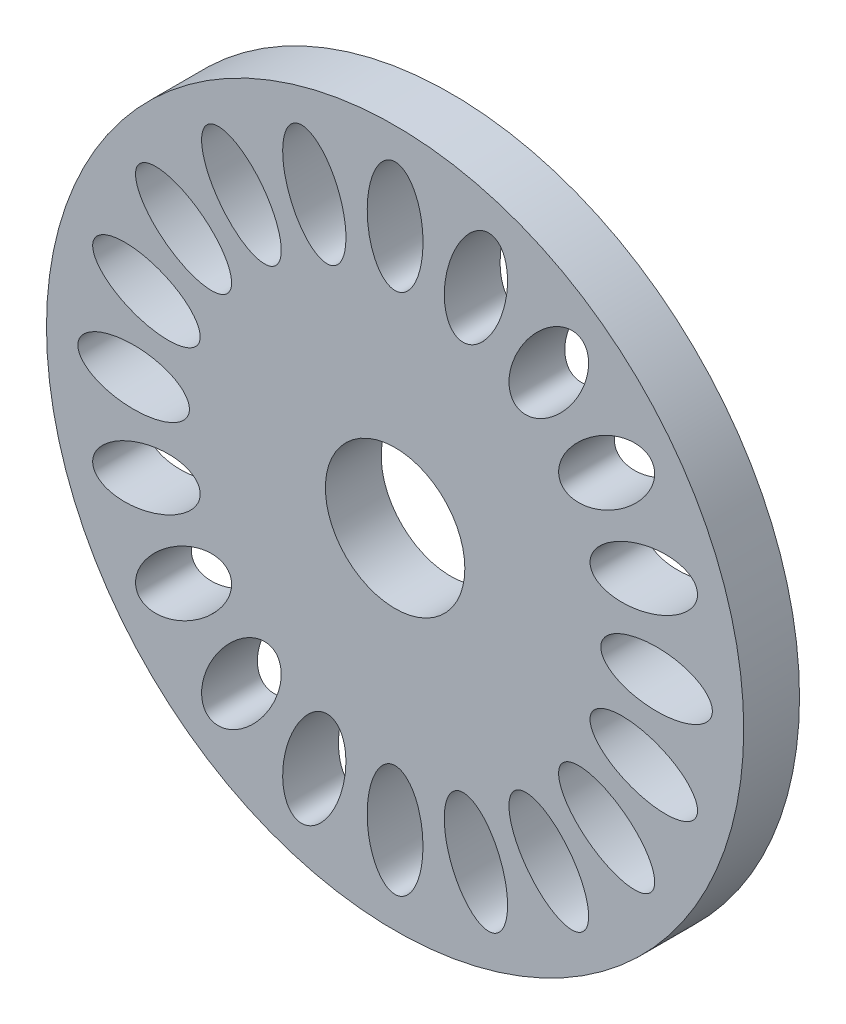
ISO-10303-21;
HEADER;
FILE_DESCRIPTION(('STEP AP214'),'2;1');
FILE_NAME('part.step','',(''),(''),'','','');
FILE_SCHEMA(('AUTOMOTIVE_DESIGN { 1 0 10303 214 1 1 1 1 }'));
ENDSEC;
DATA;
#1=APPLICATION_CONTEXT('core data for automotive mechanical design processes');
#2=APPLICATION_PROTOCOL_DEFINITION('international standard','automotive_design',2000,#1);
#3=PRODUCT_CONTEXT('',#1,'mechanical');
#4=PRODUCT('Part','Part','',(#3));
#5=PRODUCT_RELATED_PRODUCT_CATEGORY('part','',(#4));
#6=PRODUCT_DEFINITION_FORMATION('','',#4);
#7=PRODUCT_DEFINITION_CONTEXT('part definition',#1,'design');
#8=PRODUCT_DEFINITION('design','',#6,#7);
#9=PRODUCT_DEFINITION_SHAPE('','',#8);
#10=(LENGTH_UNIT() NAMED_UNIT(*) SI_UNIT(.MILLI.,.METRE.));
#11=(NAMED_UNIT(*) PLANE_ANGLE_UNIT() SI_UNIT($,.RADIAN.));
#12=(NAMED_UNIT(*) SI_UNIT($,.STERADIAN.) SOLID_ANGLE_UNIT());
#13=UNCERTAINTY_MEASURE_WITH_UNIT(LENGTH_MEASURE(1.E-05),#10,'distance_accuracy_value','');
#14=(GEOMETRIC_REPRESENTATION_CONTEXT(3) GLOBAL_UNCERTAINTY_ASSIGNED_CONTEXT((#13)) GLOBAL_UNIT_ASSIGNED_CONTEXT((#10,
#11,#12)) REPRESENTATION_CONTEXT('',''));
#15=CARTESIAN_POINT('',(0.,0.,0.));
#16=DIRECTION('',(0.,0.,1.));
#17=DIRECTION('',(1.,0.,0.));
#18=AXIS2_PLACEMENT_3D('',#15,#16,#17);
#19=CARTESIAN_POINT('',(0.,0.,2.));
#20=DIRECTION('',(0.,0.,1.));
#21=DIRECTION('',(1.,0.,0.));
#22=AXIS2_PLACEMENT_3D('',#19,#20,#21);
#23=PLANE('',#22);
#24=CARTESIAN_POINT('',(-5.51048674024184,7.58453432226521,2.));
#25=DIRECTION('',(0.,0.,1.));
#26=DIRECTION('',(0.587785252292463,-0.809016994374955,0.));
#27=AXIS2_PLACEMENT_3D('',#24,#25,#26);
#28=ELLIPSE('',#27,2.,1.);
#29=CARTESIAN_POINT('',(-4.33491623565691,5.9665003335153,2.));
#30=VERTEX_POINT('',#29);
#31=EDGE_CURVE('E181',#30,#30,#28,.T.);
#32=ORIENTED_EDGE('',*,*,#31,.F.);
#33=EDGE_LOOP('',(#32));
#34=FACE_BOUND('',#33,.T.);
#35=CARTESIAN_POINT('',(-8.91615484026703,2.89703432226523,2.));
#36=DIRECTION('',(0.,0.,1.));
#37=DIRECTION('',(0.95105651629515,-0.309016994374958,0.));
#38=AXIS2_PLACEMENT_3D('',#35,#36,#37);
#39=ELLIPSE('',#38,2.,1.);
#40=CARTESIAN_POINT('',(-7.01404180767673,2.27900033351532,2.));
#41=VERTEX_POINT('',#40);
#42=EDGE_CURVE('E207',#41,#41,#39,.T.);
#43=ORIENTED_EDGE('',*,*,#42,.F.);
#44=EDGE_LOOP('',(#43));
#45=FACE_BOUND('',#44,.T.);
#46=CARTESIAN_POINT('',(-8.91615484026709,-2.89703432226505,2.));
#47=DIRECTION('',(0.,0.,1.));
#48=DIRECTION('',(0.951056516295156,0.309016994374939,0.));
#49=AXIS2_PLACEMENT_3D('',#46,#47,#48);
#50=ELLIPSE('',#49,2.,1.);
#51=CARTESIAN_POINT('',(-7.01404180767678,-2.27900033351517,2.));
#52=VERTEX_POINT('',#51);
#53=EDGE_CURVE('E231',#52,#52,#50,.T.);
#54=ORIENTED_EDGE('',*,*,#53,.F.);
#55=EDGE_LOOP('',(#54));
#56=FACE_BOUND('',#55,.T.);
#57=CARTESIAN_POINT('',(-5.510486740242,-7.58453432226508,2.));
#58=DIRECTION('',(0.,0.,1.));
#59=DIRECTION('',(0.58778525229248,0.809016994374943,0.));
#60=AXIS2_PLACEMENT_3D('',#57,#58,#59);
#61=ELLIPSE('',#60,2.,1.);
#62=CARTESIAN_POINT('',(-4.33491623565704,-5.9665003335152,2.));
#63=VERTEX_POINT('',#62);
#64=EDGE_CURVE('E244',#63,#63,#61,.T.);
#65=ORIENTED_EDGE('',*,*,#64,.F.);
#66=EDGE_LOOP('',(#65));
#67=FACE_BOUND('',#66,.T.);
#68=CARTESIAN_POINT('',(0.,-9.375,2.));
#69=DIRECTION('',(0.,0.,1.));
#70=DIRECTION('',(0.,1.,0.));
#71=AXIS2_PLACEMENT_3D('',#68,#69,#70);
#72=ELLIPSE('',#71,2.,1.);
#73=CARTESIAN_POINT('',(0.,-7.375,2.));
#74=VERTEX_POINT('',#73);
#75=EDGE_CURVE('E267',#74,#74,#72,.T.);
#76=ORIENTED_EDGE('',*,*,#75,.F.);
#77=EDGE_LOOP('',(#76));
#78=FACE_BOUND('',#77,.T.);
#79=CARTESIAN_POINT('',(5.51048674024189,-7.58453432226516,2.));
#80=DIRECTION('',(0.,0.,1.));
#81=DIRECTION('',(-0.587785252292469,0.809016994374951,0.));
#82=AXIS2_PLACEMENT_3D('',#79,#80,#81);
#83=ELLIPSE('',#82,2.,1.);
#84=CARTESIAN_POINT('',(4.33491623565696,-5.96650033351526,2.));
#85=VERTEX_POINT('',#84);
#86=EDGE_CURVE('E291',#85,#85,#83,.T.);
#87=ORIENTED_EDGE('',*,*,#86,.F.);
#88=EDGE_LOOP('',(#87));
#89=FACE_BOUND('',#88,.T.);
#90=CARTESIAN_POINT('',(8.91615484026705,-2.89703432226517,2.));
#91=DIRECTION('',(0.,0.,1.));
#92=DIRECTION('',(-0.951056516295153,0.309016994374951,0.));
#93=AXIS2_PLACEMENT_3D('',#90,#91,#92);
#94=ELLIPSE('',#93,2.,1.);
#95=CARTESIAN_POINT('',(7.01404180767675,-2.27900033351527,2.));
#96=VERTEX_POINT('',#95);
#97=EDGE_CURVE('E304',#96,#96,#94,.T.);
#98=ORIENTED_EDGE('',*,*,#97,.F.);
#99=EDGE_LOOP('',(#98));
#100=FACE_BOUND('',#99,.T.);
#101=CARTESIAN_POINT('',(8.91615484026708,2.89703432226511,2.));
#102=DIRECTION('',(0.,0.,1.));
#103=DIRECTION('',(-0.951056516295154,-0.309016994374945,0.));
#104=AXIS2_PLACEMENT_3D('',#101,#102,#103);
#105=ELLIPSE('',#104,2.,1.);
#106=CARTESIAN_POINT('',(7.01404180767677,2.27900033351522,2.));
#107=VERTEX_POINT('',#106);
#108=EDGE_CURVE('E327',#107,#107,#105,.T.);
#109=ORIENTED_EDGE('',*,*,#108,.F.);
#110=EDGE_LOOP('',(#109));
#111=FACE_BOUND('',#110,.T.);
#112=CARTESIAN_POINT('',(5.51048674024195,7.58453432226513,2.));
#113=DIRECTION('',(0.,0.,1.));
#114=DIRECTION('',(-0.587785252292473,-0.809016994374947,0.));
#115=AXIS2_PLACEMENT_3D('',#112,#113,#114);
#116=ELLIPSE('',#115,2.,1.);
#117=CARTESIAN_POINT('',(4.334916235657,5.96650033351523,2.));
#118=VERTEX_POINT('',#117);
#119=EDGE_CURVE('E346',#118,#118,#116,.T.);
#120=ORIENTED_EDGE('',*,*,#119,.F.);
#121=EDGE_LOOP('',(#120));
#122=FACE_BOUND('',#121,.T.);
#123=CARTESIAN_POINT('',(0.,9.375,2.));
#124=DIRECTION('',(0.,0.,1.));
#125=DIRECTION('',(0.,-1.,0.));
#126=AXIS2_PLACEMENT_3D('',#123,#124,#125);
#127=ELLIPSE('',#126,2.,1.);
#128=CARTESIAN_POINT('',(0.,7.375,2.));
#129=VERTEX_POINT('',#128);
#130=EDGE_CURVE('E56',#129,#129,#127,.T.);
#131=ORIENTED_EDGE('',*,*,#130,.F.);
#132=EDGE_LOOP('',(#131));
#133=FACE_BOUND('',#132,.T.);
#134=CARTESIAN_POINT('',(0.,0.,2.));
#135=DIRECTION('',(0.,0.,1.));
#136=DIRECTION('',(1.,0.,0.));
#137=AXIS2_PLACEMENT_3D('',#134,#135,#136);
#138=CIRCLE('',#137,12.5);
#139=CARTESIAN_POINT('',(12.5,0.,2.));
#140=VERTEX_POINT('',#139);
#141=EDGE_CURVE('E10',#140,#140,#138,.T.);
#142=ORIENTED_EDGE('',*,*,#141,.T.);
#143=EDGE_LOOP('',(#142));
#144=FACE_BOUND('',#143,.T.);
#145=CARTESIAN_POINT('',(0.,0.,2.));
#146=DIRECTION('',(0.,0.,1.));
#147=DIRECTION('',(1.,0.,0.));
#148=AXIS2_PLACEMENT_3D('',#145,#146,#147);
#149=CIRCLE('',#148,2.5);
#150=CARTESIAN_POINT('',(2.5,0.,2.));
#151=VERTEX_POINT('',#150);
#152=EDGE_CURVE('E50',#151,#151,#149,.T.);
#153=ORIENTED_EDGE('',*,*,#152,.F.);
#154=EDGE_LOOP('',(#153));
#155=FACE_BOUND('',#154,.T.);
#156=CARTESIAN_POINT('',(2.89703432226514,8.91615484026707,2.));
#157=DIRECTION('',(0.,0.,1.));
#158=DIRECTION('',(-0.309016994374948,-0.951056516295153,0.));
#159=AXIS2_PLACEMENT_3D('',#156,#157,#158);
#160=ELLIPSE('',#159,2.,1.);
#161=CARTESIAN_POINT('',(2.27900033351524,7.01404180767676,2.));
#162=VERTEX_POINT('',#161);
#163=EDGE_CURVE('E64',#162,#162,#160,.T.);
#164=ORIENTED_EDGE('',*,*,#163,.F.);
#165=EDGE_LOOP('',(#164));
#166=FACE_BOUND('',#165,.T.);
#167=CARTESIAN_POINT('',(7.58453432226514,5.51048674024192,2.));
#168=DIRECTION('',(0.,0.,1.));
#169=DIRECTION('',(-0.809016994374948,-0.587785252292472,0.));
#170=AXIS2_PLACEMENT_3D('',#167,#168,#169);
#171=ELLIPSE('',#170,2.,1.);
#172=CARTESIAN_POINT('',(5.96650033351525,4.33491623565698,2.));
#173=VERTEX_POINT('',#172);
#174=EDGE_CURVE('E334',#173,#173,#171,.T.);
#175=ORIENTED_EDGE('',*,*,#174,.F.);
#176=EDGE_LOOP('',(#175));
#177=FACE_BOUND('',#176,.T.);
#178=CARTESIAN_POINT('',(9.375,0.,2.));
#179=DIRECTION('',(0.,0.,1.));
#180=DIRECTION('',(-1.,0.,0.));
#181=AXIS2_PLACEMENT_3D('',#178,#179,#180);
#182=ELLIPSE('',#181,2.,1.);
#183=CARTESIAN_POINT('',(7.375,0.,2.));
#184=VERTEX_POINT('',#183);
#185=EDGE_CURVE('E321',#184,#184,#182,.T.);
#186=ORIENTED_EDGE('',*,*,#185,.F.);
#187=EDGE_LOOP('',(#186));
#188=FACE_BOUND('',#187,.T.);
#189=CARTESIAN_POINT('',(7.58453432226511,-5.51048674024197,2.));
#190=DIRECTION('',(0.,0.,1.));
#191=DIRECTION('',(-0.809016994374945,0.587785252292476,0.));
#192=AXIS2_PLACEMENT_3D('',#189,#190,#191);
#193=ELLIPSE('',#192,2.,1.);
#194=CARTESIAN_POINT('',(5.96650033351522,-4.33491623565702,2.));
#195=VERTEX_POINT('',#194);
#196=EDGE_CURVE('E297',#195,#195,#193,.T.);
#197=ORIENTED_EDGE('',*,*,#196,.F.);
#198=EDGE_LOOP('',(#197));
#199=FACE_BOUND('',#198,.T.);
#200=CARTESIAN_POINT('',(2.89703432226508,-8.91615484026709,2.));
#201=DIRECTION('',(0.,0.,1.));
#202=DIRECTION('',(-0.309016994374941,0.951056516295156,0.));
#203=AXIS2_PLACEMENT_3D('',#200,#201,#202);
#204=ELLIPSE('',#203,2.,1.);
#205=CARTESIAN_POINT('',(2.27900033351519,-7.01404180767677,2.));
#206=VERTEX_POINT('',#205);
#207=EDGE_CURVE('E274',#206,#206,#204,.T.);
#208=ORIENTED_EDGE('',*,*,#207,.F.);
#209=EDGE_LOOP('',(#208));
#210=FACE_BOUND('',#209,.T.);
#211=CARTESIAN_POINT('',(-2.8970343222652,-8.91615484026704,2.));
#212=DIRECTION('',(0.,0.,1.));
#213=DIRECTION('',(0.309016994374954,0.951056516295151,0.));
#214=AXIS2_PLACEMENT_3D('',#211,#212,#213);
#215=ELLIPSE('',#214,2.,1.);
#216=CARTESIAN_POINT('',(-2.27900033351529,-7.01404180767674,2.));
#217=VERTEX_POINT('',#216);
#218=EDGE_CURVE('E261',#217,#217,#215,.T.);
#219=ORIENTED_EDGE('',*,*,#218,.F.);
#220=EDGE_LOOP('',(#219));
#221=FACE_BOUND('',#220,.T.);
#222=CARTESIAN_POINT('',(-7.58453432226519,-5.51048674024186,2.));
#223=DIRECTION('',(0.,0.,1.));
#224=DIRECTION('',(0.809016994374953,0.587785252292466,0.));
#225=AXIS2_PLACEMENT_3D('',#222,#223,#224);
#226=ELLIPSE('',#225,2.,1.);
#227=CARTESIAN_POINT('',(-5.96650033351528,-4.33491623565693,2.));
#228=VERTEX_POINT('',#227);
#229=EDGE_CURVE('E237',#228,#228,#226,.T.);
#230=ORIENTED_EDGE('',*,*,#229,.F.);
#231=EDGE_LOOP('',(#230));
#232=FACE_BOUND('',#231,.T.);
#233=CARTESIAN_POINT('',(-9.375,0.,2.));
#234=DIRECTION('',(0.,0.,1.));
#235=DIRECTION('',(1.,0.,0.));
#236=AXIS2_PLACEMENT_3D('',#233,#234,#235);
#237=ELLIPSE('',#236,2.,1.);
#238=CARTESIAN_POINT('',(-7.375,0.,2.));
#239=VERTEX_POINT('',#238);
#240=EDGE_CURVE('E214',#239,#239,#237,.T.);
#241=ORIENTED_EDGE('',*,*,#240,.F.);
#242=EDGE_LOOP('',(#241));
#243=FACE_BOUND('',#242,.T.);
#244=CARTESIAN_POINT('',(-7.58453432226507,5.51048674024203,2.));
#245=DIRECTION('',(0.,0.,1.));
#246=DIRECTION('',(0.809016994374941,-0.587785252292483,0.));
#247=AXIS2_PLACEMENT_3D('',#244,#245,#246);
#248=ELLIPSE('',#247,2.,1.);
#249=CARTESIAN_POINT('',(-5.96650033351518,4.33491623565706,2.));
#250=VERTEX_POINT('',#249);
#251=EDGE_CURVE('E201',#250,#250,#248,.T.);
#252=ORIENTED_EDGE('',*,*,#251,.F.);
#253=EDGE_LOOP('',(#252));
#254=FACE_BOUND('',#253,.T.);
#255=CARTESIAN_POINT('',(-2.89703432226502,8.9161548402671,2.));
#256=DIRECTION('',(0.,0.,1.));
#257=DIRECTION('',(0.309016994374935,-0.951056516295158,0.));
#258=AXIS2_PLACEMENT_3D('',#255,#256,#257);
#259=ELLIPSE('',#258,2.,1.);
#260=CARTESIAN_POINT('',(-2.27900033351514,7.01404180767679,2.));
#261=VERTEX_POINT('',#260);
#262=EDGE_CURVE('E174',#261,#261,#259,.T.);
#263=ORIENTED_EDGE('',*,*,#262,.F.);
#264=EDGE_LOOP('',(#263));
#265=FACE_BOUND('',#264,.T.);
#266=ADVANCED_FACE('F37',(#34,#45,#56,#67,#78,#89,#100,#111,#122,#133,#144,#155,#166,#177,#188,
#199,#210,#221,#232,#243,#254,#265),#23,.T.);
#267=CARTESIAN_POINT('',(0.,0.,0.));
#268=DIRECTION('',(0.,0.,1.));
#269=DIRECTION('',(1.,0.,0.));
#270=AXIS2_PLACEMENT_3D('',#267,#268,#269);
#271=PLANE('',#270);
#272=CARTESIAN_POINT('',(0.,0.,0.));
#273=DIRECTION('',(0.,0.,1.));
#274=DIRECTION('',(1.,0.,0.));
#275=AXIS2_PLACEMENT_3D('',#272,#273,#274);
#276=CIRCLE('',#275,12.5);
#277=CARTESIAN_POINT('',(12.5,0.,0.));
#278=VERTEX_POINT('',#277);
#279=EDGE_CURVE('E41',#278,#278,#276,.T.);
#280=ORIENTED_EDGE('',*,*,#279,.F.);
#281=EDGE_LOOP('',(#280));
#282=FACE_BOUND('',#281,.T.);
#283=CARTESIAN_POINT('',(0.,0.,0.));
#284=DIRECTION('',(0.,0.,1.));
#285=DIRECTION('',(1.,0.,0.));
#286=AXIS2_PLACEMENT_3D('',#283,#284,#285);
#287=CIRCLE('',#286,2.5);
#288=CARTESIAN_POINT('',(2.5,0.,0.));
#289=VERTEX_POINT('',#288);
#290=EDGE_CURVE('E52',#289,#289,#287,.T.);
#291=ORIENTED_EDGE('',*,*,#290,.T.);
#292=EDGE_LOOP('',(#291));
#293=FACE_BOUND('',#292,.T.);
#294=CARTESIAN_POINT('',(0.,9.375,0.));
#295=DIRECTION('',(0.,0.,1.));
#296=DIRECTION('',(0.,-1.,0.));
#297=AXIS2_PLACEMENT_3D('',#294,#295,#296);
#298=ELLIPSE('',#297,2.,1.);
#299=CARTESIAN_POINT('',(0.,7.375,0.));
#300=VERTEX_POINT('',#299);
#301=EDGE_CURVE('E60',#300,#300,#298,.T.);
#302=ORIENTED_EDGE('',*,*,#301,.T.);
#303=EDGE_LOOP('',(#302));
#304=FACE_BOUND('',#303,.T.);
#305=CARTESIAN_POINT('',(2.89703432226514,8.91615484026707,0.));
#306=DIRECTION('',(0.,0.,1.));
#307=DIRECTION('',(-0.309016994374948,-0.951056516295153,0.));
#308=AXIS2_PLACEMENT_3D('',#305,#306,#307);
#309=ELLIPSE('',#308,2.,1.);
#310=CARTESIAN_POINT('',(2.27900033351524,7.01404180767676,0.));
#311=VERTEX_POINT('',#310);
#312=EDGE_CURVE('E69',#311,#311,#309,.T.);
#313=ORIENTED_EDGE('',*,*,#312,.T.);
#314=EDGE_LOOP('',(#313));
#315=FACE_BOUND('',#314,.T.);
#316=CARTESIAN_POINT('',(5.51048674024195,7.58453432226513,0.));
#317=DIRECTION('',(0.,0.,1.));
#318=DIRECTION('',(-0.587785252292473,-0.809016994374947,0.));
#319=AXIS2_PLACEMENT_3D('',#316,#317,#318);
#320=ELLIPSE('',#319,2.,1.);
#321=CARTESIAN_POINT('',(4.334916235657,5.96650033351523,0.));
#322=VERTEX_POINT('',#321);
#323=EDGE_CURVE('E104',#322,#322,#320,.T.);
#324=ORIENTED_EDGE('',*,*,#323,.T.);
#325=EDGE_LOOP('',(#324));
#326=FACE_BOUND('',#325,.T.);
#327=CARTESIAN_POINT('',(7.58453432226514,5.51048674024192,0.));
#328=DIRECTION('',(0.,0.,1.));
#329=DIRECTION('',(-0.809016994374948,-0.587785252292472,0.));
#330=AXIS2_PLACEMENT_3D('',#327,#328,#329);
#331=ELLIPSE('',#330,2.,1.);
#332=CARTESIAN_POINT('',(5.96650033351525,4.33491623565698,0.));
#333=VERTEX_POINT('',#332);
#334=EDGE_CURVE('E108',#333,#333,#331,.T.);
#335=ORIENTED_EDGE('',*,*,#334,.T.);
#336=EDGE_LOOP('',(#335));
#337=FACE_BOUND('',#336,.T.);
#338=CARTESIAN_POINT('',(8.91615484026708,2.89703432226511,0.));
#339=DIRECTION('',(0.,0.,1.));
#340=DIRECTION('',(-0.951056516295154,-0.309016994374945,0.));
#341=AXIS2_PLACEMENT_3D('',#338,#339,#340);
#342=ELLIPSE('',#341,2.,1.);
#343=CARTESIAN_POINT('',(7.01404180767677,2.27900033351522,0.));
#344=VERTEX_POINT('',#343);
#345=EDGE_CURVE('E112',#344,#344,#342,.T.);
#346=ORIENTED_EDGE('',*,*,#345,.T.);
#347=EDGE_LOOP('',(#346));
#348=FACE_BOUND('',#347,.T.);
#349=CARTESIAN_POINT('',(9.375,0.,0.));
#350=DIRECTION('',(0.,0.,1.));
#351=DIRECTION('',(-1.,0.,0.));
#352=AXIS2_PLACEMENT_3D('',#349,#350,#351);
#353=ELLIPSE('',#352,2.,1.);
#354=CARTESIAN_POINT('',(7.375,0.,0.));
#355=VERTEX_POINT('',#354);
#356=EDGE_CURVE('E116',#355,#355,#353,.T.);
#357=ORIENTED_EDGE('',*,*,#356,.T.);
#358=EDGE_LOOP('',(#357));
#359=FACE_BOUND('',#358,.T.);
#360=CARTESIAN_POINT('',(8.91615484026705,-2.89703432226517,0.));
#361=DIRECTION('',(0.,0.,1.));
#362=DIRECTION('',(-0.951056516295153,0.309016994374951,0.));
#363=AXIS2_PLACEMENT_3D('',#360,#361,#362);
#364=ELLIPSE('',#363,2.,1.);
#365=CARTESIAN_POINT('',(7.01404180767675,-2.27900033351527,0.));
#366=VERTEX_POINT('',#365);
#367=EDGE_CURVE('E120',#366,#366,#364,.T.);
#368=ORIENTED_EDGE('',*,*,#367,.T.);
#369=EDGE_LOOP('',(#368));
#370=FACE_BOUND('',#369,.T.);
#371=CARTESIAN_POINT('',(7.58453432226511,-5.51048674024197,0.));
#372=DIRECTION('',(0.,0.,1.));
#373=DIRECTION('',(-0.809016994374945,0.587785252292476,0.));
#374=AXIS2_PLACEMENT_3D('',#371,#372,#373);
#375=ELLIPSE('',#374,2.,1.);
#376=CARTESIAN_POINT('',(5.96650033351522,-4.33491623565702,0.));
#377=VERTEX_POINT('',#376);
#378=EDGE_CURVE('E124',#377,#377,#375,.T.);
#379=ORIENTED_EDGE('',*,*,#378,.T.);
#380=EDGE_LOOP('',(#379));
#381=FACE_BOUND('',#380,.T.);
#382=CARTESIAN_POINT('',(5.51048674024189,-7.58453432226516,0.));
#383=DIRECTION('',(0.,0.,1.));
#384=DIRECTION('',(-0.587785252292469,0.809016994374951,0.));
#385=AXIS2_PLACEMENT_3D('',#382,#383,#384);
#386=ELLIPSE('',#385,2.,1.);
#387=CARTESIAN_POINT('',(4.33491623565696,-5.96650033351526,0.));
#388=VERTEX_POINT('',#387);
#389=EDGE_CURVE('E128',#388,#388,#386,.T.);
#390=ORIENTED_EDGE('',*,*,#389,.T.);
#391=EDGE_LOOP('',(#390));
#392=FACE_BOUND('',#391,.T.);
#393=CARTESIAN_POINT('',(2.89703432226508,-8.91615484026709,0.));
#394=DIRECTION('',(0.,0.,1.));
#395=DIRECTION('',(-0.309016994374941,0.951056516295156,0.));
#396=AXIS2_PLACEMENT_3D('',#393,#394,#395);
#397=ELLIPSE('',#396,2.,1.);
#398=CARTESIAN_POINT('',(2.27900033351519,-7.01404180767677,0.));
#399=VERTEX_POINT('',#398);
#400=EDGE_CURVE('E132',#399,#399,#397,.T.);
#401=ORIENTED_EDGE('',*,*,#400,.T.);
#402=EDGE_LOOP('',(#401));
#403=FACE_BOUND('',#402,.T.);
#404=CARTESIAN_POINT('',(0.,-9.375,0.));
#405=DIRECTION('',(0.,0.,1.));
#406=DIRECTION('',(0.,1.,0.));
#407=AXIS2_PLACEMENT_3D('',#404,#405,#406);
#408=ELLIPSE('',#407,2.,1.);
#409=CARTESIAN_POINT('',(0.,-7.375,0.));
#410=VERTEX_POINT('',#409);
#411=EDGE_CURVE('E136',#410,#410,#408,.T.);
#412=ORIENTED_EDGE('',*,*,#411,.T.);
#413=EDGE_LOOP('',(#412));
#414=FACE_BOUND('',#413,.T.);
#415=CARTESIAN_POINT('',(-2.8970343222652,-8.91615484026704,0.));
#416=DIRECTION('',(0.,0.,1.));
#417=DIRECTION('',(0.309016994374954,0.951056516295151,0.));
#418=AXIS2_PLACEMENT_3D('',#415,#416,#417);
#419=ELLIPSE('',#418,2.,1.);
#420=CARTESIAN_POINT('',(-2.27900033351529,-7.01404180767674,0.));
#421=VERTEX_POINT('',#420);
#422=EDGE_CURVE('E140',#421,#421,#419,.T.);
#423=ORIENTED_EDGE('',*,*,#422,.T.);
#424=EDGE_LOOP('',(#423));
#425=FACE_BOUND('',#424,.T.);
#426=CARTESIAN_POINT('',(-5.510486740242,-7.58453432226508,0.));
#427=DIRECTION('',(0.,0.,1.));
#428=DIRECTION('',(0.58778525229248,0.809016994374943,0.));
#429=AXIS2_PLACEMENT_3D('',#426,#427,#428);
#430=ELLIPSE('',#429,2.,1.);
#431=CARTESIAN_POINT('',(-4.33491623565704,-5.9665003335152,0.));
#432=VERTEX_POINT('',#431);
#433=EDGE_CURVE('E144',#432,#432,#430,.T.);
#434=ORIENTED_EDGE('',*,*,#433,.T.);
#435=EDGE_LOOP('',(#434));
#436=FACE_BOUND('',#435,.T.);
#437=CARTESIAN_POINT('',(-7.58453432226519,-5.51048674024186,0.));
#438=DIRECTION('',(0.,0.,1.));
#439=DIRECTION('',(0.809016994374953,0.587785252292466,0.));
#440=AXIS2_PLACEMENT_3D('',#437,#438,#439);
#441=ELLIPSE('',#440,2.,1.);
#442=CARTESIAN_POINT('',(-5.96650033351528,-4.33491623565693,0.));
#443=VERTEX_POINT('',#442);
#444=EDGE_CURVE('E148',#443,#443,#441,.T.);
#445=ORIENTED_EDGE('',*,*,#444,.T.);
#446=EDGE_LOOP('',(#445));
#447=FACE_BOUND('',#446,.T.);
#448=CARTESIAN_POINT('',(-8.91615484026709,-2.89703432226505,0.));
#449=DIRECTION('',(0.,0.,1.));
#450=DIRECTION('',(0.951056516295156,0.309016994374939,0.));
#451=AXIS2_PLACEMENT_3D('',#448,#449,#450);
#452=ELLIPSE('',#451,2.,1.);
#453=CARTESIAN_POINT('',(-7.01404180767678,-2.27900033351517,0.));
#454=VERTEX_POINT('',#453);
#455=EDGE_CURVE('E152',#454,#454,#452,.T.);
#456=ORIENTED_EDGE('',*,*,#455,.T.);
#457=EDGE_LOOP('',(#456));
#458=FACE_BOUND('',#457,.T.);
#459=CARTESIAN_POINT('',(-9.375,0.,0.));
#460=DIRECTION('',(0.,0.,1.));
#461=DIRECTION('',(1.,0.,0.));
#462=AXIS2_PLACEMENT_3D('',#459,#460,#461);
#463=ELLIPSE('',#462,2.,1.);
#464=CARTESIAN_POINT('',(-7.375,0.,0.));
#465=VERTEX_POINT('',#464);
#466=EDGE_CURVE('E156',#465,#465,#463,.T.);
#467=ORIENTED_EDGE('',*,*,#466,.T.);
#468=EDGE_LOOP('',(#467));
#469=FACE_BOUND('',#468,.T.);
#470=CARTESIAN_POINT('',(-8.91615484026703,2.89703432226523,0.));
#471=DIRECTION('',(0.,0.,1.));
#472=DIRECTION('',(0.95105651629515,-0.309016994374958,0.));
#473=AXIS2_PLACEMENT_3D('',#470,#471,#472);
#474=ELLIPSE('',#473,2.,1.);
#475=CARTESIAN_POINT('',(-7.01404180767673,2.27900033351532,0.));
#476=VERTEX_POINT('',#475);
#477=EDGE_CURVE('E160',#476,#476,#474,.T.);
#478=ORIENTED_EDGE('',*,*,#477,.T.);
#479=EDGE_LOOP('',(#478));
#480=FACE_BOUND('',#479,.T.);
#481=CARTESIAN_POINT('',(-7.58453432226507,5.51048674024203,0.));
#482=DIRECTION('',(0.,0.,1.));
#483=DIRECTION('',(0.809016994374941,-0.587785252292483,0.));
#484=AXIS2_PLACEMENT_3D('',#481,#482,#483);
#485=ELLIPSE('',#484,2.,1.);
#486=CARTESIAN_POINT('',(-5.96650033351518,4.33491623565706,0.));
#487=VERTEX_POINT('',#486);
#488=EDGE_CURVE('E164',#487,#487,#485,.T.);
#489=ORIENTED_EDGE('',*,*,#488,.T.);
#490=EDGE_LOOP('',(#489));
#491=FACE_BOUND('',#490,.T.);
#492=CARTESIAN_POINT('',(-5.51048674024184,7.58453432226521,0.));
#493=DIRECTION('',(0.,0.,1.));
#494=DIRECTION('',(0.587785252292463,-0.809016994374955,0.));
#495=AXIS2_PLACEMENT_3D('',#492,#493,#494);
#496=ELLIPSE('',#495,2.,1.);
#497=CARTESIAN_POINT('',(-4.33491623565691,5.9665003335153,0.));
#498=VERTEX_POINT('',#497);
#499=EDGE_CURVE('E168',#498,#498,#496,.T.);
#500=ORIENTED_EDGE('',*,*,#499,.T.);
#501=EDGE_LOOP('',(#500));
#502=FACE_BOUND('',#501,.T.);
#503=CARTESIAN_POINT('',(-2.89703432226502,8.9161548402671,0.));
#504=DIRECTION('',(0.,0.,1.));
#505=DIRECTION('',(0.309016994374935,-0.951056516295158,0.));
#506=AXIS2_PLACEMENT_3D('',#503,#504,#505);
#507=ELLIPSE('',#506,2.,1.);
#508=CARTESIAN_POINT('',(-2.27900033351514,7.01404180767679,0.));
#509=VERTEX_POINT('',#508);
#510=EDGE_CURVE('E171',#509,#509,#507,.T.);
#511=ORIENTED_EDGE('',*,*,#510,.T.);
#512=EDGE_LOOP('',(#511));
#513=FACE_BOUND('',#512,.T.);
#514=ADVANCED_FACE('F84',(#282,#293,#304,#315,#326,#337,#348,#359,#370,#381,#392,#403,#414,#425,
#436,#447,#458,#469,#480,#491,#502,#513),#271,.F.);
#515=CARTESIAN_POINT('',(0.,0.,2.));
#516=DIRECTION('',(0.,0.,-1.));
#517=DIRECTION('',(-1.,0.,0.));
#518=AXIS2_PLACEMENT_3D('',#515,#516,#517);
#519=CYLINDRICAL_SURFACE('',#518,12.5);
#520=ORIENTED_EDGE('',*,*,#141,.F.);
#521=EDGE_LOOP('',(#520));
#522=FACE_BOUND('',#521,.T.);
#523=ORIENTED_EDGE('',*,*,#279,.T.);
#524=EDGE_LOOP('',(#523));
#525=FACE_BOUND('',#524,.T.);
#526=ADVANCED_FACE('F39',(#522,#525),#519,.T.);
#527=CARTESIAN_POINT('',(0.,0.,2.));
#528=DIRECTION('',(0.,0.,-1.));
#529=DIRECTION('',(-1.,0.,0.));
#530=AXIS2_PLACEMENT_3D('',#527,#528,#529);
#531=CYLINDRICAL_SURFACE('',#530,2.5);
#532=ORIENTED_EDGE('',*,*,#152,.T.);
#533=EDGE_LOOP('',(#532));
#534=FACE_BOUND('',#533,.T.);
#535=ORIENTED_EDGE('',*,*,#290,.F.);
#536=EDGE_LOOP('',(#535));
#537=FACE_BOUND('',#536,.T.);
#538=ADVANCED_FACE('F77',(#534,#537),#531,.F.);
#539=DIRECTION('',(0.,0.,-1.));
#540=VECTOR('',#539,1.);
#541=SURFACE_OF_LINEAR_EXTRUSION('',#127,#540);
#542=ORIENTED_EDGE('',*,*,#130,.T.);
#543=EDGE_LOOP('',(#542));
#544=FACE_BOUND('',#543,.T.);
#545=ORIENTED_EDGE('',*,*,#301,.F.);
#546=EDGE_LOOP('',(#545));
#547=FACE_BOUND('',#546,.T.);
#548=ADVANCED_FACE('F72',(#544,#547),#541,.T.);
#549=DIRECTION('',(0.,0.,-1.));
#550=VECTOR('',#549,1.);
#551=SURFACE_OF_LINEAR_EXTRUSION('',#160,#550);
#552=ORIENTED_EDGE('',*,*,#163,.T.);
#553=EDGE_LOOP('',(#552));
#554=FACE_BOUND('',#553,.T.);
#555=ORIENTED_EDGE('',*,*,#312,.F.);
#556=EDGE_LOOP('',(#555));
#557=FACE_BOUND('',#556,.T.);
#558=ADVANCED_FACE('F76',(#554,#557),#551,.T.);
#559=DIRECTION('',(0.,0.,-1.));
#560=VECTOR('',#559,1.);
#561=SURFACE_OF_LINEAR_EXTRUSION('',#116,#560);
#562=ORIENTED_EDGE('',*,*,#119,.T.);
#563=EDGE_LOOP('',(#562));
#564=FACE_BOUND('',#563,.T.);
#565=ORIENTED_EDGE('',*,*,#323,.F.);
#566=EDGE_LOOP('',(#565));
#567=FACE_BOUND('',#566,.T.);
#568=ADVANCED_FACE('F342',(#564,#567),#561,.T.);
#569=DIRECTION('',(0.,0.,-1.));
#570=VECTOR('',#569,1.);
#571=SURFACE_OF_LINEAR_EXTRUSION('',#171,#570);
#572=ORIENTED_EDGE('',*,*,#174,.T.);
#573=EDGE_LOOP('',(#572));
#574=FACE_BOUND('',#573,.T.);
#575=ORIENTED_EDGE('',*,*,#334,.F.);
#576=EDGE_LOOP('',(#575));
#577=FACE_BOUND('',#576,.T.);
#578=ADVANCED_FACE('F340',(#574,#577),#571,.T.);
#579=DIRECTION('',(0.,0.,-1.));
#580=VECTOR('',#579,1.);
#581=SURFACE_OF_LINEAR_EXTRUSION('',#105,#580);
#582=ORIENTED_EDGE('',*,*,#108,.T.);
#583=EDGE_LOOP('',(#582));
#584=FACE_BOUND('',#583,.T.);
#585=ORIENTED_EDGE('',*,*,#345,.F.);
#586=EDGE_LOOP('',(#585));
#587=FACE_BOUND('',#586,.T.);
#588=ADVANCED_FACE('F317',(#584,#587),#581,.T.);
#589=DIRECTION('',(0.,0.,-1.));
#590=VECTOR('',#589,1.);
#591=SURFACE_OF_LINEAR_EXTRUSION('',#182,#590);
#592=ORIENTED_EDGE('',*,*,#185,.T.);
#593=EDGE_LOOP('',(#592));
#594=FACE_BOUND('',#593,.T.);
#595=ORIENTED_EDGE('',*,*,#356,.F.);
#596=EDGE_LOOP('',(#595));
#597=FACE_BOUND('',#596,.T.);
#598=ADVANCED_FACE('F313',(#594,#597),#591,.T.);
#599=DIRECTION('',(0.,0.,-1.));
#600=VECTOR('',#599,1.);
#601=SURFACE_OF_LINEAR_EXTRUSION('',#94,#600);
#602=ORIENTED_EDGE('',*,*,#97,.T.);
#603=EDGE_LOOP('',(#602));
#604=FACE_BOUND('',#603,.T.);
#605=ORIENTED_EDGE('',*,*,#367,.F.);
#606=EDGE_LOOP('',(#605));
#607=FACE_BOUND('',#606,.T.);
#608=ADVANCED_FACE('F310',(#604,#607),#601,.T.);
#609=DIRECTION('',(0.,0.,-1.));
#610=VECTOR('',#609,1.);
#611=SURFACE_OF_LINEAR_EXTRUSION('',#193,#610);
#612=ORIENTED_EDGE('',*,*,#196,.T.);
#613=EDGE_LOOP('',(#612));
#614=FACE_BOUND('',#613,.T.);
#615=ORIENTED_EDGE('',*,*,#378,.F.);
#616=EDGE_LOOP('',(#615));
#617=FACE_BOUND('',#616,.T.);
#618=ADVANCED_FACE('F287',(#614,#617),#611,.T.);
#619=DIRECTION('',(0.,0.,-1.));
#620=VECTOR('',#619,1.);
#621=SURFACE_OF_LINEAR_EXTRUSION('',#83,#620);
#622=ORIENTED_EDGE('',*,*,#86,.T.);
#623=EDGE_LOOP('',(#622));
#624=FACE_BOUND('',#623,.T.);
#625=ORIENTED_EDGE('',*,*,#389,.F.);
#626=EDGE_LOOP('',(#625));
#627=FACE_BOUND('',#626,.T.);
#628=ADVANCED_FACE('F283',(#624,#627),#621,.T.);
#629=DIRECTION('',(0.,0.,-1.));
#630=VECTOR('',#629,1.);
#631=SURFACE_OF_LINEAR_EXTRUSION('',#204,#630);
#632=ORIENTED_EDGE('',*,*,#207,.T.);
#633=EDGE_LOOP('',(#632));
#634=FACE_BOUND('',#633,.T.);
#635=ORIENTED_EDGE('',*,*,#400,.F.);
#636=EDGE_LOOP('',(#635));
#637=FACE_BOUND('',#636,.T.);
#638=ADVANCED_FACE('F280',(#634,#637),#631,.T.);
#639=DIRECTION('',(0.,0.,-1.));
#640=VECTOR('',#639,1.);
#641=SURFACE_OF_LINEAR_EXTRUSION('',#72,#640);
#642=ORIENTED_EDGE('',*,*,#75,.T.);
#643=EDGE_LOOP('',(#642));
#644=FACE_BOUND('',#643,.T.);
#645=ORIENTED_EDGE('',*,*,#411,.F.);
#646=EDGE_LOOP('',(#645));
#647=FACE_BOUND('',#646,.T.);
#648=ADVANCED_FACE('F257',(#644,#647),#641,.T.);
#649=DIRECTION('',(0.,0.,-1.));
#650=VECTOR('',#649,1.);
#651=SURFACE_OF_LINEAR_EXTRUSION('',#215,#650);
#652=ORIENTED_EDGE('',*,*,#218,.T.);
#653=EDGE_LOOP('',(#652));
#654=FACE_BOUND('',#653,.T.);
#655=ORIENTED_EDGE('',*,*,#422,.F.);
#656=EDGE_LOOP('',(#655));
#657=FACE_BOUND('',#656,.T.);
#658=ADVANCED_FACE('F253',(#654,#657),#651,.T.);
#659=DIRECTION('',(0.,0.,-1.));
#660=VECTOR('',#659,1.);
#661=SURFACE_OF_LINEAR_EXTRUSION('',#61,#660);
#662=ORIENTED_EDGE('',*,*,#64,.T.);
#663=EDGE_LOOP('',(#662));
#664=FACE_BOUND('',#663,.T.);
#665=ORIENTED_EDGE('',*,*,#433,.F.);
#666=EDGE_LOOP('',(#665));
#667=FACE_BOUND('',#666,.T.);
#668=ADVANCED_FACE('F250',(#664,#667),#661,.T.);
#669=DIRECTION('',(0.,0.,-1.));
#670=VECTOR('',#669,1.);
#671=SURFACE_OF_LINEAR_EXTRUSION('',#226,#670);
#672=ORIENTED_EDGE('',*,*,#229,.T.);
#673=EDGE_LOOP('',(#672));
#674=FACE_BOUND('',#673,.T.);
#675=ORIENTED_EDGE('',*,*,#444,.F.);
#676=EDGE_LOOP('',(#675));
#677=FACE_BOUND('',#676,.T.);
#678=ADVANCED_FACE('F227',(#674,#677),#671,.T.);
#679=DIRECTION('',(0.,0.,-1.));
#680=VECTOR('',#679,1.);
#681=SURFACE_OF_LINEAR_EXTRUSION('',#50,#680);
#682=ORIENTED_EDGE('',*,*,#53,.T.);
#683=EDGE_LOOP('',(#682));
#684=FACE_BOUND('',#683,.T.);
#685=ORIENTED_EDGE('',*,*,#455,.F.);
#686=EDGE_LOOP('',(#685));
#687=FACE_BOUND('',#686,.T.);
#688=ADVANCED_FACE('F223',(#684,#687),#681,.T.);
#689=DIRECTION('',(0.,0.,-1.));
#690=VECTOR('',#689,1.);
#691=SURFACE_OF_LINEAR_EXTRUSION('',#237,#690);
#692=ORIENTED_EDGE('',*,*,#240,.T.);
#693=EDGE_LOOP('',(#692));
#694=FACE_BOUND('',#693,.T.);
#695=ORIENTED_EDGE('',*,*,#466,.F.);
#696=EDGE_LOOP('',(#695));
#697=FACE_BOUND('',#696,.T.);
#698=ADVANCED_FACE('F220',(#694,#697),#691,.T.);
#699=DIRECTION('',(0.,0.,-1.));
#700=VECTOR('',#699,1.);
#701=SURFACE_OF_LINEAR_EXTRUSION('',#39,#700);
#702=ORIENTED_EDGE('',*,*,#42,.T.);
#703=EDGE_LOOP('',(#702));
#704=FACE_BOUND('',#703,.T.);
#705=ORIENTED_EDGE('',*,*,#477,.F.);
#706=EDGE_LOOP('',(#705));
#707=FACE_BOUND('',#706,.T.);
#708=ADVANCED_FACE('F197',(#704,#707),#701,.T.);
#709=DIRECTION('',(0.,0.,-1.));
#710=VECTOR('',#709,1.);
#711=SURFACE_OF_LINEAR_EXTRUSION('',#248,#710);
#712=ORIENTED_EDGE('',*,*,#251,.T.);
#713=EDGE_LOOP('',(#712));
#714=FACE_BOUND('',#713,.T.);
#715=ORIENTED_EDGE('',*,*,#488,.F.);
#716=EDGE_LOOP('',(#715));
#717=FACE_BOUND('',#716,.T.);
#718=ADVANCED_FACE('F193',(#714,#717),#711,.T.);
#719=DIRECTION('',(0.,0.,-1.));
#720=VECTOR('',#719,1.);
#721=SURFACE_OF_LINEAR_EXTRUSION('',#28,#720);
#722=ORIENTED_EDGE('',*,*,#31,.T.);
#723=EDGE_LOOP('',(#722));
#724=FACE_BOUND('',#723,.T.);
#725=ORIENTED_EDGE('',*,*,#499,.F.);
#726=EDGE_LOOP('',(#725));
#727=FACE_BOUND('',#726,.T.);
#728=ADVANCED_FACE('F188',(#724,#727),#721,.T.);
#729=DIRECTION('',(0.,0.,-1.));
#730=VECTOR('',#729,1.);
#731=SURFACE_OF_LINEAR_EXTRUSION('',#259,#730);
#732=ORIENTED_EDGE('',*,*,#262,.T.);
#733=EDGE_LOOP('',(#732));
#734=FACE_BOUND('',#733,.T.);
#735=ORIENTED_EDGE('',*,*,#510,.F.);
#736=EDGE_LOOP('',(#735));
#737=FACE_BOUND('',#736,.T.);
#738=ADVANCED_FACE('F192',(#734,#737),#731,.T.);
#739=CLOSED_SHELL('',(#266,#514,#526,#538,#548,#558,#568,#578,#588,#598,#608,#618,#628,#638,
#648,#658,#668,#678,#688,#698,#708,#718,#728,#738));
#740=MANIFOLD_SOLID_BREP('B2',#739);
#741=ADVANCED_BREP_SHAPE_REPRESENTATION('',(#18,#740),#14);
#742=SHAPE_DEFINITION_REPRESENTATION(#9,#741);
ENDSEC;
END-ISO-10303-21;
